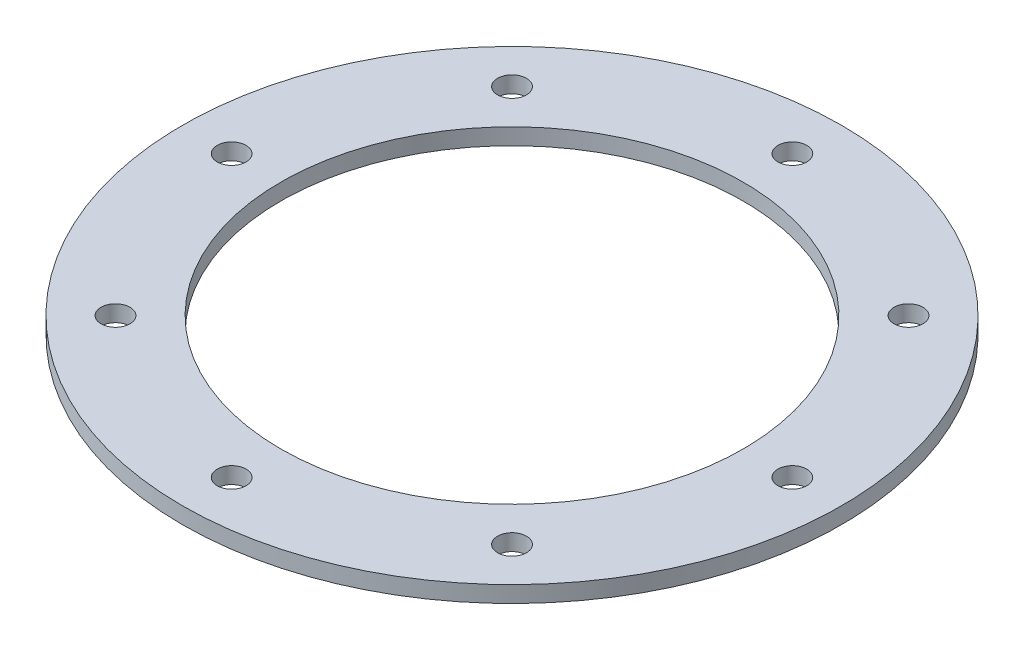
ISO-10303-21;
HEADER;
FILE_DESCRIPTION(('STEP AP214'),'2;1');
FILE_NAME('part.step','',(''),(''),'','','');
FILE_SCHEMA(('AUTOMOTIVE_DESIGN { 1 0 10303 214 1 1 1 1 }'));
ENDSEC;
DATA;
#1=APPLICATION_CONTEXT('core data for automotive mechanical design processes');
#2=APPLICATION_PROTOCOL_DEFINITION('international standard','automotive_design',2000,#1);
#3=PRODUCT_CONTEXT('',#1,'mechanical');
#4=PRODUCT('Part','Part','',(#3));
#5=PRODUCT_RELATED_PRODUCT_CATEGORY('part','',(#4));
#6=PRODUCT_DEFINITION_FORMATION('','',#4);
#7=PRODUCT_DEFINITION_CONTEXT('part definition',#1,'design');
#8=PRODUCT_DEFINITION('design','',#6,#7);
#9=PRODUCT_DEFINITION_SHAPE('','',#8);
#10=(LENGTH_UNIT() NAMED_UNIT(*) SI_UNIT(.MILLI.,.METRE.));
#11=(NAMED_UNIT(*) PLANE_ANGLE_UNIT() SI_UNIT($,.RADIAN.));
#12=(NAMED_UNIT(*) SI_UNIT($,.STERADIAN.) SOLID_ANGLE_UNIT());
#13=UNCERTAINTY_MEASURE_WITH_UNIT(LENGTH_MEASURE(1.E-05),#10,'distance_accuracy_value','');
#14=(GEOMETRIC_REPRESENTATION_CONTEXT(3) GLOBAL_UNCERTAINTY_ASSIGNED_CONTEXT((#13)) GLOBAL_UNIT_ASSIGNED_CONTEXT((#10,
#11,#12)) REPRESENTATION_CONTEXT('',''));
#15=CARTESIAN_POINT('',(0.,0.,0.));
#16=DIRECTION('',(0.,0.,1.));
#17=DIRECTION('',(1.,0.,0.));
#18=AXIS2_PLACEMENT_3D('',#15,#16,#17);
#19=CARTESIAN_POINT('',(0.,5.,0.));
#20=DIRECTION('',(0.,1.,0.));
#21=DIRECTION('',(0.,0.,1.));
#22=AXIS2_PLACEMENT_3D('',#19,#20,#21);
#23=PLANE('',#22);
#24=CARTESIAN_POINT('',(0.,5.,-85.5));
#25=DIRECTION('',(0.,1.,0.));
#26=DIRECTION('',(0.,0.,1.));
#27=AXIS2_PLACEMENT_3D('',#24,#25,#26);
#28=CIRCLE('',#27,4.4);
#29=CARTESIAN_POINT('',(0.,5.,-81.1));
#30=VERTEX_POINT('',#29);
#31=EDGE_CURVE('E92',#30,#30,#28,.T.);
#32=ORIENTED_EDGE('',*,*,#31,.F.);
#33=EDGE_LOOP('',(#32));
#34=FACE_BOUND('',#33,.T.);
#35=CARTESIAN_POINT('',(-85.5,5.,0.));
#36=DIRECTION('',(0.,1.,0.));
#37=DIRECTION('',(0.,0.,1.));
#38=AXIS2_PLACEMENT_3D('',#35,#36,#37);
#39=CIRCLE('',#38,4.4);
#40=CARTESIAN_POINT('',(-85.5,5.,4.39999999999999));
#41=VERTEX_POINT('',#40);
#42=EDGE_CURVE('E79',#41,#41,#39,.T.);
#43=ORIENTED_EDGE('',*,*,#42,.F.);
#44=EDGE_LOOP('',(#43));
#45=FACE_BOUND('',#44,.T.);
#46=CARTESIAN_POINT('',(0.,5.,85.5));
#47=DIRECTION('',(0.,1.,0.));
#48=DIRECTION('',(0.,0.,1.));
#49=AXIS2_PLACEMENT_3D('',#46,#47,#48);
#50=CIRCLE('',#49,4.4);
#51=CARTESIAN_POINT('',(0.,5.,89.9));
#52=VERTEX_POINT('',#51);
#53=EDGE_CURVE('E70',#52,#52,#50,.T.);
#54=ORIENTED_EDGE('',*,*,#53,.F.);
#55=EDGE_LOOP('',(#54));
#56=FACE_BOUND('',#55,.T.);
#57=CARTESIAN_POINT('',(85.5,5.,0.));
#58=DIRECTION('',(0.,1.,0.));
#59=DIRECTION('',(0.,0.,1.));
#60=AXIS2_PLACEMENT_3D('',#57,#58,#59);
#61=CIRCLE('',#60,4.4);
#62=CARTESIAN_POINT('',(85.5,5.,4.4));
#63=VERTEX_POINT('',#62);
#64=EDGE_CURVE('E54',#63,#63,#61,.T.);
#65=ORIENTED_EDGE('',*,*,#64,.F.);
#66=EDGE_LOOP('',(#65));
#67=FACE_BOUND('',#66,.T.);
#68=CARTESIAN_POINT('',(0.,5.,0.));
#69=DIRECTION('',(0.,1.,0.));
#70=DIRECTION('',(0.,0.,1.));
#71=AXIS2_PLACEMENT_3D('',#68,#69,#70);
#72=CIRCLE('',#71,100.5);
#73=CARTESIAN_POINT('',(0.,5.,100.5));
#74=VERTEX_POINT('',#73);
#75=EDGE_CURVE('E10',#74,#74,#72,.T.);
#76=ORIENTED_EDGE('',*,*,#75,.T.);
#77=EDGE_LOOP('',(#76));
#78=FACE_BOUND('',#77,.T.);
#79=CARTESIAN_POINT('',(0.,5.,0.));
#80=DIRECTION('',(0.,1.,0.));
#81=DIRECTION('',(0.,0.,1.));
#82=AXIS2_PLACEMENT_3D('',#79,#80,#81);
#83=CIRCLE('',#82,70.5);
#84=CARTESIAN_POINT('',(0.,5.,70.5));
#85=VERTEX_POINT('',#84);
#86=EDGE_CURVE('E49',#85,#85,#83,.T.);
#87=ORIENTED_EDGE('',*,*,#86,.F.);
#88=EDGE_LOOP('',(#87));
#89=FACE_BOUND('',#88,.T.);
#90=CARTESIAN_POINT('',(60.4576297914498,5.,60.4576297914498));
#91=DIRECTION('',(0.,1.,0.));
#92=DIRECTION('',(0.,0.,1.));
#93=AXIS2_PLACEMENT_3D('',#90,#91,#92);
#94=CIRCLE('',#93,4.39999999999998);
#95=CARTESIAN_POINT('',(60.4576297914498,5.,64.8576297914498));
#96=VERTEX_POINT('',#95);
#97=EDGE_CURVE('E64',#96,#96,#94,.T.);
#98=ORIENTED_EDGE('',*,*,#97,.F.);
#99=EDGE_LOOP('',(#98));
#100=FACE_BOUND('',#99,.T.);
#101=CARTESIAN_POINT('',(-60.4576297914498,5.,60.4576297914498));
#102=DIRECTION('',(0.,1.,0.));
#103=DIRECTION('',(0.,0.,1.));
#104=AXIS2_PLACEMENT_3D('',#101,#102,#103);
#105=CIRCLE('',#104,4.4);
#106=CARTESIAN_POINT('',(-60.4576297914498,5.,64.8576297914498));
#107=VERTEX_POINT('',#106);
#108=EDGE_CURVE('E74',#107,#107,#105,.T.);
#109=ORIENTED_EDGE('',*,*,#108,.F.);
#110=EDGE_LOOP('',(#109));
#111=FACE_BOUND('',#110,.T.);
#112=CARTESIAN_POINT('',(-60.4576297914498,5.,-60.4576297914498));
#113=DIRECTION('',(0.,1.,0.));
#114=DIRECTION('',(0.,0.,1.));
#115=AXIS2_PLACEMENT_3D('',#112,#113,#114);
#116=CIRCLE('',#115,4.4);
#117=CARTESIAN_POINT('',(-60.4576297914498,5.,-56.0576297914498));
#118=VERTEX_POINT('',#117);
#119=EDGE_CURVE('E82',#118,#118,#116,.T.);
#120=ORIENTED_EDGE('',*,*,#119,.F.);
#121=EDGE_LOOP('',(#120));
#122=FACE_BOUND('',#121,.T.);
#123=CARTESIAN_POINT('',(60.4576297914498,5.,-60.4576297914498));
#124=DIRECTION('',(0.,1.,0.));
#125=DIRECTION('',(0.,0.,1.));
#126=AXIS2_PLACEMENT_3D('',#123,#124,#125);
#127=CIRCLE('',#126,4.4);
#128=CARTESIAN_POINT('',(60.4576297914498,5.,-56.0576297914498));
#129=VERTEX_POINT('',#128);
#130=EDGE_CURVE('E97',#129,#129,#127,.T.);
#131=ORIENTED_EDGE('',*,*,#130,.F.);
#132=EDGE_LOOP('',(#131));
#133=FACE_BOUND('',#132,.T.);
#134=ADVANCED_FACE('F39',(#34,#45,#56,#67,#78,#89,#100,#111,#122,#133),#23,.T.);
#135=CARTESIAN_POINT('',(0.,0.,0.));
#136=DIRECTION('',(0.,1.,0.));
#137=DIRECTION('',(0.,0.,1.));
#138=AXIS2_PLACEMENT_3D('',#135,#136,#137);
#139=PLANE('',#138);
#140=CARTESIAN_POINT('',(0.,0.,0.));
#141=DIRECTION('',(0.,1.,0.));
#142=DIRECTION('',(0.,0.,1.));
#143=AXIS2_PLACEMENT_3D('',#140,#141,#142);
#144=CIRCLE('',#143,100.5);
#145=CARTESIAN_POINT('',(0.,0.,100.5));
#146=VERTEX_POINT('',#145);
#147=EDGE_CURVE('E43',#146,#146,#144,.T.);
#148=ORIENTED_EDGE('',*,*,#147,.F.);
#149=EDGE_LOOP('',(#148));
#150=FACE_BOUND('',#149,.T.);
#151=CARTESIAN_POINT('',(0.,0.,0.));
#152=DIRECTION('',(0.,1.,0.));
#153=DIRECTION('',(0.,0.,1.));
#154=AXIS2_PLACEMENT_3D('',#151,#152,#153);
#155=CIRCLE('',#154,70.5);
#156=CARTESIAN_POINT('',(0.,0.,70.5));
#157=VERTEX_POINT('',#156);
#158=EDGE_CURVE('E55',#157,#157,#155,.T.);
#159=ORIENTED_EDGE('',*,*,#158,.T.);
#160=EDGE_LOOP('',(#159));
#161=FACE_BOUND('',#160,.T.);
#162=CARTESIAN_POINT('',(85.5,0.,0.));
#163=DIRECTION('',(0.,1.,0.));
#164=DIRECTION('',(0.,0.,1.));
#165=AXIS2_PLACEMENT_3D('',#162,#163,#164);
#166=CIRCLE('',#165,4.4);
#167=CARTESIAN_POINT('',(85.5,0.,4.4));
#168=VERTEX_POINT('',#167);
#169=EDGE_CURVE('E59',#168,#168,#166,.T.);
#170=ORIENTED_EDGE('',*,*,#169,.T.);
#171=EDGE_LOOP('',(#170));
#172=FACE_BOUND('',#171,.T.);
#173=CARTESIAN_POINT('',(60.4576297914498,0.,60.4576297914498));
#174=DIRECTION('',(0.,1.,0.));
#175=DIRECTION('',(0.,0.,1.));
#176=AXIS2_PLACEMENT_3D('',#173,#174,#175);
#177=CIRCLE('',#176,4.39999999999998);
#178=CARTESIAN_POINT('',(60.4576297914498,0.,64.8576297914498));
#179=VERTEX_POINT('',#178);
#180=EDGE_CURVE('E63',#179,#179,#177,.T.);
#181=ORIENTED_EDGE('',*,*,#180,.T.);
#182=EDGE_LOOP('',(#181));
#183=FACE_BOUND('',#182,.T.);
#184=CARTESIAN_POINT('',(0.,0.,85.5));
#185=DIRECTION('',(0.,1.,0.));
#186=DIRECTION('',(0.,0.,1.));
#187=AXIS2_PLACEMENT_3D('',#184,#185,#186);
#188=CIRCLE('',#187,4.4);
#189=CARTESIAN_POINT('',(0.,0.,89.9));
#190=VERTEX_POINT('',#189);
#191=EDGE_CURVE('E69',#190,#190,#188,.T.);
#192=ORIENTED_EDGE('',*,*,#191,.T.);
#193=EDGE_LOOP('',(#192));
#194=FACE_BOUND('',#193,.T.);
#195=CARTESIAN_POINT('',(-60.4576297914498,0.,60.4576297914498));
#196=DIRECTION('',(0.,1.,0.));
#197=DIRECTION('',(0.,0.,1.));
#198=AXIS2_PLACEMENT_3D('',#195,#196,#197);
#199=CIRCLE('',#198,4.4);
#200=CARTESIAN_POINT('',(-60.4576297914498,0.,64.8576297914498));
#201=VERTEX_POINT('',#200);
#202=EDGE_CURVE('E77',#201,#201,#199,.T.);
#203=ORIENTED_EDGE('',*,*,#202,.T.);
#204=EDGE_LOOP('',(#203));
#205=FACE_BOUND('',#204,.T.);
#206=CARTESIAN_POINT('',(-85.5,0.,0.));
#207=DIRECTION('',(0.,1.,0.));
#208=DIRECTION('',(0.,0.,1.));
#209=AXIS2_PLACEMENT_3D('',#206,#207,#208);
#210=CIRCLE('',#209,4.4);
#211=CARTESIAN_POINT('',(-85.5,0.,4.39999999999999));
#212=VERTEX_POINT('',#211);
#213=EDGE_CURVE('E81',#212,#212,#210,.T.);
#214=ORIENTED_EDGE('',*,*,#213,.T.);
#215=EDGE_LOOP('',(#214));
#216=FACE_BOUND('',#215,.T.);
#217=CARTESIAN_POINT('',(-60.4576297914498,0.,-60.4576297914498));
#218=DIRECTION('',(0.,1.,0.));
#219=DIRECTION('',(0.,0.,1.));
#220=AXIS2_PLACEMENT_3D('',#217,#218,#219);
#221=CIRCLE('',#220,4.4);
#222=CARTESIAN_POINT('',(-60.4576297914498,0.,-56.0576297914498));
#223=VERTEX_POINT('',#222);
#224=EDGE_CURVE('E88',#223,#223,#221,.T.);
#225=ORIENTED_EDGE('',*,*,#224,.T.);
#226=EDGE_LOOP('',(#225));
#227=FACE_BOUND('',#226,.T.);
#228=CARTESIAN_POINT('',(0.,0.,-85.5));
#229=DIRECTION('',(0.,1.,0.));
#230=DIRECTION('',(0.,0.,1.));
#231=AXIS2_PLACEMENT_3D('',#228,#229,#230);
#232=CIRCLE('',#231,4.4);
#233=CARTESIAN_POINT('',(0.,0.,-81.1));
#234=VERTEX_POINT('',#233);
#235=EDGE_CURVE('E91',#234,#234,#232,.T.);
#236=ORIENTED_EDGE('',*,*,#235,.T.);
#237=EDGE_LOOP('',(#236));
#238=FACE_BOUND('',#237,.T.);
#239=CARTESIAN_POINT('',(60.4576297914498,0.,-60.4576297914498));
#240=DIRECTION('',(0.,1.,0.));
#241=DIRECTION('',(0.,0.,1.));
#242=AXIS2_PLACEMENT_3D('',#239,#240,#241);
#243=CIRCLE('',#242,4.4);
#244=CARTESIAN_POINT('',(60.4576297914498,0.,-56.0576297914498));
#245=VERTEX_POINT('',#244);
#246=EDGE_CURVE('E99',#245,#245,#243,.T.);
#247=ORIENTED_EDGE('',*,*,#246,.T.);
#248=EDGE_LOOP('',(#247));
#249=FACE_BOUND('',#248,.T.);
#250=ADVANCED_FACE('F109',(#150,#161,#172,#183,#194,#205,#216,#227,#238,#249),#139,.F.);
#251=CARTESIAN_POINT('',(0.,5.,0.));
#252=DIRECTION('',(0.,-1.,0.));
#253=DIRECTION('',(0.,0.,-1.));
#254=AXIS2_PLACEMENT_3D('',#251,#252,#253);
#255=CYLINDRICAL_SURFACE('',#254,100.5);
#256=ORIENTED_EDGE('',*,*,#75,.F.);
#257=EDGE_LOOP('',(#256));
#258=FACE_BOUND('',#257,.T.);
#259=ORIENTED_EDGE('',*,*,#147,.T.);
#260=EDGE_LOOP('',(#259));
#261=FACE_BOUND('',#260,.T.);
#262=ADVANCED_FACE('F41',(#258,#261),#255,.T.);
#263=CARTESIAN_POINT('',(0.,5.,0.));
#264=DIRECTION('',(0.,-1.,0.));
#265=DIRECTION('',(0.,0.,-1.));
#266=AXIS2_PLACEMENT_3D('',#263,#264,#265);
#267=CYLINDRICAL_SURFACE('',#266,70.5);
#268=ORIENTED_EDGE('',*,*,#86,.T.);
#269=EDGE_LOOP('',(#268));
#270=FACE_BOUND('',#269,.T.);
#271=ORIENTED_EDGE('',*,*,#158,.F.);
#272=EDGE_LOOP('',(#271));
#273=FACE_BOUND('',#272,.T.);
#274=ADVANCED_FACE('F119',(#270,#273),#267,.F.);
#275=CARTESIAN_POINT('',(85.5,5.,0.));
#276=DIRECTION('',(0.,-1.,0.));
#277=DIRECTION('',(0.,0.,-1.));
#278=AXIS2_PLACEMENT_3D('',#275,#276,#277);
#279=CYLINDRICAL_SURFACE('',#278,4.4);
#280=ORIENTED_EDGE('',*,*,#64,.T.);
#281=EDGE_LOOP('',(#280));
#282=FACE_BOUND('',#281,.T.);
#283=ORIENTED_EDGE('',*,*,#169,.F.);
#284=EDGE_LOOP('',(#283));
#285=FACE_BOUND('',#284,.T.);
#286=ADVANCED_FACE('F124',(#282,#285),#279,.F.);
#287=CARTESIAN_POINT('',(60.4576297914498,5.,60.4576297914498));
#288=DIRECTION('',(0.,-1.,0.));
#289=DIRECTION('',(0.,0.,-1.));
#290=AXIS2_PLACEMENT_3D('',#287,#288,#289);
#291=CYLINDRICAL_SURFACE('',#290,4.39999999999998);
#292=ORIENTED_EDGE('',*,*,#97,.T.);
#293=EDGE_LOOP('',(#292));
#294=FACE_BOUND('',#293,.T.);
#295=ORIENTED_EDGE('',*,*,#180,.F.);
#296=EDGE_LOOP('',(#295));
#297=FACE_BOUND('',#296,.T.);
#298=ADVANCED_FACE('F126',(#294,#297),#291,.F.);
#299=CARTESIAN_POINT('',(0.,5.,85.5));
#300=DIRECTION('',(0.,-1.,0.));
#301=DIRECTION('',(0.,0.,-1.));
#302=AXIS2_PLACEMENT_3D('',#299,#300,#301);
#303=CYLINDRICAL_SURFACE('',#302,4.4);
#304=ORIENTED_EDGE('',*,*,#53,.T.);
#305=EDGE_LOOP('',(#304));
#306=FACE_BOUND('',#305,.T.);
#307=ORIENTED_EDGE('',*,*,#191,.F.);
#308=EDGE_LOOP('',(#307));
#309=FACE_BOUND('',#308,.T.);
#310=ADVANCED_FACE('F131',(#306,#309),#303,.F.);
#311=CARTESIAN_POINT('',(-60.4576297914498,5.,60.4576297914498));
#312=DIRECTION('',(0.,-1.,0.));
#313=DIRECTION('',(0.,0.,-1.));
#314=AXIS2_PLACEMENT_3D('',#311,#312,#313);
#315=CYLINDRICAL_SURFACE('',#314,4.4);
#316=ORIENTED_EDGE('',*,*,#108,.T.);
#317=EDGE_LOOP('',(#316));
#318=FACE_BOUND('',#317,.T.);
#319=ORIENTED_EDGE('',*,*,#202,.F.);
#320=EDGE_LOOP('',(#319));
#321=FACE_BOUND('',#320,.T.);
#322=ADVANCED_FACE('F134',(#318,#321),#315,.F.);
#323=CARTESIAN_POINT('',(-85.5,5.,0.));
#324=DIRECTION('',(0.,-1.,0.));
#325=DIRECTION('',(0.,0.,-1.));
#326=AXIS2_PLACEMENT_3D('',#323,#324,#325);
#327=CYLINDRICAL_SURFACE('',#326,4.4);
#328=ORIENTED_EDGE('',*,*,#42,.T.);
#329=EDGE_LOOP('',(#328));
#330=FACE_BOUND('',#329,.T.);
#331=ORIENTED_EDGE('',*,*,#213,.F.);
#332=EDGE_LOOP('',(#331));
#333=FACE_BOUND('',#332,.T.);
#334=ADVANCED_FACE('F136',(#330,#333),#327,.F.);
#335=CARTESIAN_POINT('',(-60.4576297914498,5.,-60.4576297914498));
#336=DIRECTION('',(0.,-1.,0.));
#337=DIRECTION('',(0.,0.,-1.));
#338=AXIS2_PLACEMENT_3D('',#335,#336,#337);
#339=CYLINDRICAL_SURFACE('',#338,4.4);
#340=ORIENTED_EDGE('',*,*,#119,.T.);
#341=EDGE_LOOP('',(#340));
#342=FACE_BOUND('',#341,.T.);
#343=ORIENTED_EDGE('',*,*,#224,.F.);
#344=EDGE_LOOP('',(#343));
#345=FACE_BOUND('',#344,.T.);
#346=ADVANCED_FACE('F141',(#342,#345),#339,.F.);
#347=CARTESIAN_POINT('',(0.,5.,-85.5));
#348=DIRECTION('',(0.,-1.,0.));
#349=DIRECTION('',(0.,0.,-1.));
#350=AXIS2_PLACEMENT_3D('',#347,#348,#349);
#351=CYLINDRICAL_SURFACE('',#350,4.4);
#352=ORIENTED_EDGE('',*,*,#31,.T.);
#353=EDGE_LOOP('',(#352));
#354=FACE_BOUND('',#353,.T.);
#355=ORIENTED_EDGE('',*,*,#235,.F.);
#356=EDGE_LOOP('',(#355));
#357=FACE_BOUND('',#356,.T.);
#358=ADVANCED_FACE('F146',(#354,#357),#351,.F.);
#359=CARTESIAN_POINT('',(60.4576297914498,5.,-60.4576297914498));
#360=DIRECTION('',(0.,-1.,0.));
#361=DIRECTION('',(0.,0.,-1.));
#362=AXIS2_PLACEMENT_3D('',#359,#360,#361);
#363=CYLINDRICAL_SURFACE('',#362,4.4);
#364=ORIENTED_EDGE('',*,*,#130,.T.);
#365=EDGE_LOOP('',(#364));
#366=FACE_BOUND('',#365,.T.);
#367=ORIENTED_EDGE('',*,*,#246,.F.);
#368=EDGE_LOOP('',(#367));
#369=FACE_BOUND('',#368,.T.);
#370=ADVANCED_FACE('F106',(#366,#369),#363,.F.);
#371=CLOSED_SHELL('',(#134,#250,#262,#274,#286,#298,#310,#322,#334,#346,#358,#370));
#372=MANIFOLD_SOLID_BREP('B2',#371);
#373=ADVANCED_BREP_SHAPE_REPRESENTATION('',(#18,#372),#14);
#374=SHAPE_DEFINITION_REPRESENTATION(#9,#373);
ENDSEC;
END-ISO-10303-21;
